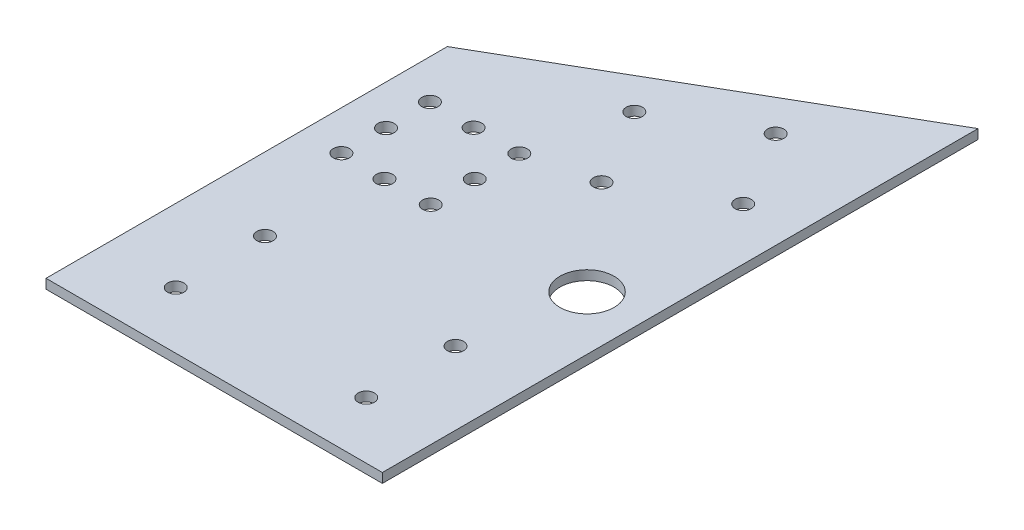
ISO-10303-21;
HEADER;
FILE_DESCRIPTION(('STEP AP214'),'2;1');
FILE_NAME('part.step','',(''),(''),'','','');
FILE_SCHEMA(('AUTOMOTIVE_DESIGN { 1 0 10303 214 1 1 1 1 }'));
ENDSEC;
DATA;
#1=APPLICATION_CONTEXT('core data for automotive mechanical design processes');
#2=APPLICATION_PROTOCOL_DEFINITION('international standard','automotive_design',2000,#1);
#3=PRODUCT_CONTEXT('',#1,'mechanical');
#4=PRODUCT('Part','Part','',(#3));
#5=PRODUCT_RELATED_PRODUCT_CATEGORY('part','',(#4));
#6=PRODUCT_DEFINITION_FORMATION('','',#4);
#7=PRODUCT_DEFINITION_CONTEXT('part definition',#1,'design');
#8=PRODUCT_DEFINITION('design','',#6,#7);
#9=PRODUCT_DEFINITION_SHAPE('','',#8);
#10=(LENGTH_UNIT() NAMED_UNIT(*) SI_UNIT(.MILLI.,.METRE.));
#11=(NAMED_UNIT(*) PLANE_ANGLE_UNIT() SI_UNIT($,.RADIAN.));
#12=(NAMED_UNIT(*) SI_UNIT($,.STERADIAN.) SOLID_ANGLE_UNIT());
#13=UNCERTAINTY_MEASURE_WITH_UNIT(LENGTH_MEASURE(1.E-05),#10,'distance_accuracy_value','');
#14=(GEOMETRIC_REPRESENTATION_CONTEXT(3) GLOBAL_UNCERTAINTY_ASSIGNED_CONTEXT((#13)) GLOBAL_UNIT_ASSIGNED_CONTEXT((#10,
#11,#12)) REPRESENTATION_CONTEXT('',''));
#15=CARTESIAN_POINT('',(0.,0.,0.));
#16=DIRECTION('',(0.,0.,1.));
#17=DIRECTION('',(1.,0.,0.));
#18=AXIS2_PLACEMENT_3D('',#15,#16,#17);
#19=CARTESIAN_POINT('',(0.,3.5,0.));
#20=DIRECTION('',(0.,1.,0.));
#21=DIRECTION('',(0.,0.,1.));
#22=AXIS2_PLACEMENT_3D('',#19,#20,#21);
#23=PLANE('',#22);
#24=CARTESIAN_POINT('',(-9.80070272899665,3.50000000000004,29.0193966277296));
#25=DIRECTION('',(0.,-1.,0.));
#26=DIRECTION('',(0.,0.,-1.));
#27=AXIS2_PLACEMENT_3D('',#24,#25,#26);
#28=CIRCLE('',#27,2.99999999999996);
#29=CARTESIAN_POINT('',(-9.80070272899665,3.50000000000004,26.0193966277297));
#30=VERTEX_POINT('',#29);
#31=EDGE_CURVE('E204',#30,#30,#28,.T.);
#32=ORIENTED_EDGE('',*,*,#31,.T.);
#33=EDGE_LOOP('',(#32));
#34=FACE_BOUND('',#33,.T.);
#35=CARTESIAN_POINT('',(35.166341481369,3.50000000000004,-83.2853062262013));
#36=DIRECTION('',(0.,-1.,0.));
#37=DIRECTION('',(0.,0.,-1.));
#38=AXIS2_PLACEMENT_3D('',#35,#36,#37);
#39=CIRCLE('',#38,2.99999999999995);
#40=CARTESIAN_POINT('',(35.166341481369,3.50000000000004,-86.2853062262013));
#41=VERTEX_POINT('',#40);
#42=EDGE_CURVE('E191',#41,#41,#39,.T.);
#43=ORIENTED_EDGE('',*,*,#42,.T.);
#44=EDGE_LOOP('',(#43));
#45=FACE_BOUND('',#44,.T.);
#46=CARTESIAN_POINT('',(18.6893739268313,3.50000000000004,-111.869808159963));
#47=DIRECTION('',(0.,-1.,0.));
#48=DIRECTION('',(0.,0.,-1.));
#49=AXIS2_PLACEMENT_3D('',#46,#47,#48);
#50=CIRCLE('',#49,2.99999999999995);
#51=CARTESIAN_POINT('',(18.6893739268313,3.50000000000004,-114.869808159963));
#52=VERTEX_POINT('',#51);
#53=EDGE_CURVE('E187',#52,#52,#50,.T.);
#54=ORIENTED_EDGE('',*,*,#53,.T.);
#55=EDGE_LOOP('',(#54));
#56=FACE_BOUND('',#55,.T.);
#57=CARTESIAN_POINT('',(51.7728808308047,3.50000000000004,-130.999098464774));
#58=DIRECTION('',(0.,-1.,0.));
#59=DIRECTION('',(0.,0.,-1.));
#60=AXIS2_PLACEMENT_3D('',#57,#58,#59);
#61=CIRCLE('',#60,2.99999999999995);
#62=CARTESIAN_POINT('',(51.7728808308047,3.50000000000004,-133.999098464774));
#63=VERTEX_POINT('',#62);
#64=EDGE_CURVE('E186',#63,#63,#61,.T.);
#65=ORIENTED_EDGE('',*,*,#64,.T.);
#66=EDGE_LOOP('',(#65));
#67=FACE_BOUND('',#66,.T.);
#68=CARTESIAN_POINT('',(68.2603104177391,3.50000000000004,-102.517776293385));
#69=DIRECTION('',(0.,-1.,0.));
#70=DIRECTION('',(0.,0.,-1.));
#71=AXIS2_PLACEMENT_3D('',#68,#69,#70);
#72=CIRCLE('',#71,2.99999999999996);
#73=CARTESIAN_POINT('',(68.2603104177391,3.50000000000004,-105.517776293385));
#74=VERTEX_POINT('',#73);
#75=EDGE_CURVE('E182',#74,#74,#72,.T.);
#76=ORIENTED_EDGE('',*,*,#75,.T.);
#77=EDGE_LOOP('',(#76));
#78=FACE_BOUND('',#77,.T.);
#79=CARTESIAN_POINT('',(-5.93933245517503,3.5,-77.1329096570055));
#80=DIRECTION('',(0.,1.,0.));
#81=DIRECTION('',(0.,0.,1.));
#82=AXIS2_PLACEMENT_3D('',#79,#80,#81);
#83=CIRCLE('',#82,2.99999999999999);
#84=CARTESIAN_POINT('',(-5.93933245517503,3.5,-74.1329096570055));
#85=VERTEX_POINT('',#84);
#86=EDGE_CURVE('E177',#85,#85,#83,.T.);
#87=ORIENTED_EDGE('',*,*,#86,.F.);
#88=EDGE_LOOP('',(#87));
#89=FACE_BOUND('',#88,.T.);
#90=CARTESIAN_POINT('',(-5.99562083449613,3.49999999999745,-44.2780507197012));
#91=DIRECTION('',(0.,1.,0.));
#92=DIRECTION('',(0.,0.,1.));
#93=AXIS2_PLACEMENT_3D('',#90,#91,#92);
#94=CIRCLE('',#93,2.99999999999999);
#95=CARTESIAN_POINT('',(-5.99562083449613,3.49999999999745,-41.2780507197012));
#96=VERTEX_POINT('',#95);
#97=EDGE_CURVE('E172',#96,#96,#94,.T.);
#98=ORIENTED_EDGE('',*,*,#97,.F.);
#99=EDGE_LOOP('',(#98));
#100=FACE_BOUND('',#99,.T.);
#101=CARTESIAN_POINT('',(10.6965095388021,3.5,-60.9230178026109));
#102=DIRECTION('',(0.,1.,0.));
#103=DIRECTION('',(0.,0.,1.));
#104=AXIS2_PLACEMENT_3D('',#101,#102,#103);
#105=CIRCLE('',#104,2.99999999999999);
#106=CARTESIAN_POINT('',(10.6965095388021,3.5,-57.923017802611));
#107=VERTEX_POINT('',#106);
#108=EDGE_CURVE('E167',#107,#107,#105,.T.);
#109=ORIENTED_EDGE('',*,*,#108,.F.);
#110=EDGE_LOOP('',(#109));
#111=FACE_BOUND('',#110,.T.);
#112=CARTESIAN_POINT('',(-21.9836339352316,3.49999999999412,-60.8350897133052));
#113=DIRECTION('',(0.,1.,0.));
#114=DIRECTION('',(0.,0.,1.));
#115=AXIS2_PLACEMENT_3D('',#112,#113,#114);
#116=CIRCLE('',#115,2.99999999999999);
#117=CARTESIAN_POINT('',(-21.9836339352316,3.49999999999412,-57.8350897133052));
#118=VERTEX_POINT('',#117);
#119=EDGE_CURVE('E162',#118,#118,#116,.T.);
#120=ORIENTED_EDGE('',*,*,#119,.F.);
#121=EDGE_LOOP('',(#120));
#122=FACE_BOUND('',#121,.T.);
#123=CARTESIAN_POINT('',(-22.196476194119,3.49999999999999,-44.5730614047825));
#124=DIRECTION('',(0.,-1.,0.));
#125=DIRECTION('',(0.,0.,-1.));
#126=AXIS2_PLACEMENT_3D('',#123,#124,#125);
#127=CIRCLE('',#126,2.99999999999995);
#128=CARTESIAN_POINT('',(-22.196476194119,3.49999999999999,-47.5730614047824));
#129=VERTEX_POINT('',#128);
#130=EDGE_CURVE('E157',#129,#129,#127,.T.);
#131=ORIENTED_EDGE('',*,*,#130,.T.);
#132=EDGE_LOOP('',(#131));
#133=FACE_BOUND('',#132,.T.);
#134=CARTESIAN_POINT('',(10.7634000000005,3.49999999999999,-44.5865701704838));
#135=DIRECTION('',(0.,-1.,0.));
#136=DIRECTION('',(0.,0.,-1.));
#137=AXIS2_PLACEMENT_3D('',#134,#135,#136);
#138=CIRCLE('',#137,2.99999999999996);
#139=CARTESIAN_POINT('',(10.7634000000005,3.49999999999999,-47.5865701704837));
#140=VERTEX_POINT('',#139);
#141=EDGE_CURVE('E152',#140,#140,#138,.T.);
#142=ORIENTED_EDGE('',*,*,#141,.T.);
#143=EDGE_LOOP('',(#142));
#144=FACE_BOUND('',#143,.T.);
#145=CARTESIAN_POINT('',(10.7634000000011,3.49999999999999,-77.3099708436573));
#146=DIRECTION('',(0.,-1.,0.));
#147=DIRECTION('',(0.,0.,-1.));
#148=AXIS2_PLACEMENT_3D('',#145,#146,#147);
#149=CIRCLE('',#148,2.99999999999996);
#150=CARTESIAN_POINT('',(10.7634000000011,3.49999999999999,-80.3099708436572));
#151=VERTEX_POINT('',#150);
#152=EDGE_CURVE('E147',#151,#151,#149,.T.);
#153=ORIENTED_EDGE('',*,*,#152,.T.);
#154=EDGE_LOOP('',(#153));
#155=FACE_BOUND('',#154,.T.);
#156=CARTESIAN_POINT('',(-22.2365999998677,3.49999999999999,-77.3099708436573));
#157=DIRECTION('',(0.,-1.,0.));
#158=DIRECTION('',(0.,0.,-1.));
#159=AXIS2_PLACEMENT_3D('',#156,#157,#158);
#160=CIRCLE('',#159,2.99999999999995);
#161=CARTESIAN_POINT('',(-22.2365999998677,3.49999999999999,-80.3099708436573));
#162=VERTEX_POINT('',#161);
#163=EDGE_CURVE('E146',#162,#162,#160,.T.);
#164=ORIENTED_EDGE('',*,*,#163,.T.);
#165=EDGE_LOOP('',(#164));
#166=FACE_BOUND('',#165,.T.);
#167=CARTESIAN_POINT('',(-9.80070272899659,3.50000000000004,-3.94272746035045));
#168=DIRECTION('',(0.,-1.,0.));
#169=DIRECTION('',(0.,0.,-1.));
#170=AXIS2_PLACEMENT_3D('',#167,#168,#169);
#171=CIRCLE('',#170,2.99999999999996);
#172=CARTESIAN_POINT('',(-9.80070272899659,3.50000000000004,-6.94272746035041));
#173=VERTEX_POINT('',#172);
#174=EDGE_CURVE('E141',#173,#173,#171,.T.);
#175=ORIENTED_EDGE('',*,*,#174,.T.);
#176=EDGE_LOOP('',(#175));
#177=FACE_BOUND('',#176,.T.);
#178=CARTESIAN_POINT('',(60.5775706837832,3.50000000000004,-3.94094338704159));
#179=DIRECTION('',(0.,-1.,0.));
#180=DIRECTION('',(0.,0.,-1.));
#181=AXIS2_PLACEMENT_3D('',#178,#179,#180);
#182=CIRCLE('',#181,2.99999999999996);
#183=CARTESIAN_POINT('',(60.5775706837832,3.50000000000004,-6.94094338704155));
#184=VERTEX_POINT('',#183);
#185=EDGE_CURVE('E136',#184,#184,#182,.T.);
#186=ORIENTED_EDGE('',*,*,#185,.T.);
#187=EDGE_LOOP('',(#186));
#188=FACE_BOUND('',#187,.T.);
#189=CARTESIAN_POINT('',(60.5641027289967,3.50000000000004,29.0193966277296));
#190=DIRECTION('',(0.,-1.,0.));
#191=DIRECTION('',(0.,0.,-1.));
#192=AXIS2_PLACEMENT_3D('',#189,#190,#191);
#193=CIRCLE('',#192,2.99999999999996);
#194=CARTESIAN_POINT('',(60.5641027289967,3.50000000000004,26.0193966277297));
#195=VERTEX_POINT('',#194);
#196=EDGE_CURVE('E135',#195,#195,#193,.T.);
#197=ORIENTED_EDGE('',*,*,#196,.T.);
#198=EDGE_LOOP('',(#197));
#199=FACE_BOUND('',#198,.T.);
#200=DIRECTION('',(0.,0.,-1.));
#201=VECTOR('',#200,1.);
#202=CARTESIAN_POINT('',(87.5,3.5,0.));
#203=LINE('',#202,#201);
#204=CARTESIAN_POINT('',(87.5,3.5,50.));
#205=VERTEX_POINT('',#204);
#206=CARTESIAN_POINT('',(87.5,3.5,-170.));
#207=VERTEX_POINT('',#206);
#208=EDGE_CURVE('E91',#205,#207,#203,.T.);
#209=ORIENTED_EDGE('',*,*,#208,.T.);
#210=DIRECTION('',(-0.865928383336909,0.,0.500168006705274));
#211=VECTOR('',#210,1.);
#212=CARTESIAN_POINT('',(87.5,3.5,-170.));
#213=LINE('',#212,#211);
#214=CARTESIAN_POINT('',(-36.7366,3.5,-98.2398247042286));
#215=VERTEX_POINT('',#214);
#216=EDGE_CURVE('E94',#207,#215,#213,.T.);
#217=ORIENTED_EDGE('',*,*,#216,.T.);
#218=DIRECTION('',(0.,0.,1.));
#219=VECTOR('',#218,1.);
#220=CARTESIAN_POINT('',(-36.7366,3.5,-58.2398247042286));
#221=LINE('',#220,#219);
#222=CARTESIAN_POINT('',(-36.7366,3.5,50.));
#223=VERTEX_POINT('',#222);
#224=EDGE_CURVE('E98',#215,#223,#221,.T.);
#225=ORIENTED_EDGE('',*,*,#224,.T.);
#226=DIRECTION('',(1.,0.,0.));
#227=VECTOR('',#226,1.);
#228=CARTESIAN_POINT('',(-36.7366,3.5,50.));
#229=LINE('',#228,#227);
#230=EDGE_CURVE('E63',#223,#205,#229,.T.);
#231=ORIENTED_EDGE('',*,*,#230,.T.);
#232=EDGE_LOOP('',(#209,#217,#225,#231));
#233=FACE_BOUND('',#232,.T.);
#234=CARTESIAN_POINT('',(67.5,3.5,-45.58328615));
#235=DIRECTION('',(0.,1.,0.));
#236=DIRECTION('',(0.,0.,1.));
#237=AXIS2_PLACEMENT_3D('',#234,#235,#236);
#238=CIRCLE('',#237,9.99999999999999);
#239=CARTESIAN_POINT('',(67.5,3.5,-35.58328615));
#240=VERTEX_POINT('',#239);
#241=EDGE_CURVE('E118',#240,#240,#238,.T.);
#242=ORIENTED_EDGE('',*,*,#241,.F.);
#243=EDGE_LOOP('',(#242));
#244=FACE_BOUND('',#243,.T.);
#245=ADVANCED_FACE('F43',(#34,#45,#56,#67,#78,#89,#100,#111,#122,#133,#144,#155,#166,#177,#188,
#199,#233,#244),#23,.T.);
#246=CARTESIAN_POINT('',(0.,0.,0.));
#247=DIRECTION('',(0.,1.,0.));
#248=DIRECTION('',(0.,0.,1.));
#249=AXIS2_PLACEMENT_3D('',#246,#247,#248);
#250=PLANE('',#249);
#251=CARTESIAN_POINT('',(-9.80070272899665,0.,29.0193966277296));
#252=DIRECTION('',(0.,1.,0.));
#253=DIRECTION('',(0.,0.,1.));
#254=AXIS2_PLACEMENT_3D('',#251,#252,#253);
#255=CIRCLE('',#254,2.99999999999997);
#256=CARTESIAN_POINT('',(-9.80070272899665,0.,32.0193966277296));
#257=VERTEX_POINT('',#256);
#258=EDGE_CURVE('E47',#257,#257,#255,.T.);
#259=ORIENTED_EDGE('',*,*,#258,.T.);
#260=EDGE_LOOP('',(#259));
#261=FACE_BOUND('',#260,.T.);
#262=CARTESIAN_POINT('',(35.166341481369,0.,-83.2853062262013));
#263=DIRECTION('',(0.,1.,0.));
#264=DIRECTION('',(0.,0.,1.));
#265=AXIS2_PLACEMENT_3D('',#262,#263,#264);
#266=CIRCLE('',#265,2.99999999999997);
#267=CARTESIAN_POINT('',(35.166341481369,0.,-80.2853062262013));
#268=VERTEX_POINT('',#267);
#269=EDGE_CURVE('E188',#268,#268,#266,.T.);
#270=ORIENTED_EDGE('',*,*,#269,.T.);
#271=EDGE_LOOP('',(#270));
#272=FACE_BOUND('',#271,.T.);
#273=CARTESIAN_POINT('',(18.6893739268313,0.,-111.869808159963));
#274=DIRECTION('',(0.,1.,0.));
#275=DIRECTION('',(0.,0.,1.));
#276=AXIS2_PLACEMENT_3D('',#273,#274,#275);
#277=CIRCLE('',#276,2.99999999999997);
#278=CARTESIAN_POINT('',(18.6893739268313,0.,-108.869808159963));
#279=VERTEX_POINT('',#278);
#280=EDGE_CURVE('E183',#279,#279,#277,.T.);
#281=ORIENTED_EDGE('',*,*,#280,.T.);
#282=EDGE_LOOP('',(#281));
#283=FACE_BOUND('',#282,.T.);
#284=CARTESIAN_POINT('',(51.7728808308047,0.,-130.999098464774));
#285=DIRECTION('',(0.,1.,0.));
#286=DIRECTION('',(0.,0.,1.));
#287=AXIS2_PLACEMENT_3D('',#284,#285,#286);
#288=CIRCLE('',#287,2.99999999999997);
#289=CARTESIAN_POINT('',(51.7728808308047,0.,-127.999098464774));
#290=VERTEX_POINT('',#289);
#291=EDGE_CURVE('E210',#290,#290,#288,.T.);
#292=ORIENTED_EDGE('',*,*,#291,.T.);
#293=EDGE_LOOP('',(#292));
#294=FACE_BOUND('',#293,.T.);
#295=CARTESIAN_POINT('',(68.2603104177391,0.,-102.517776293385));
#296=DIRECTION('',(0.,1.,0.));
#297=DIRECTION('',(0.,0.,1.));
#298=AXIS2_PLACEMENT_3D('',#295,#296,#297);
#299=CIRCLE('',#298,2.99999999999998);
#300=CARTESIAN_POINT('',(68.2603104177391,0.,-99.5177762933853));
#301=VERTEX_POINT('',#300);
#302=EDGE_CURVE('E178',#301,#301,#299,.T.);
#303=ORIENTED_EDGE('',*,*,#302,.T.);
#304=EDGE_LOOP('',(#303));
#305=FACE_BOUND('',#304,.T.);
#306=CARTESIAN_POINT('',(-5.93933245517503,0.,-77.1329096570055));
#307=DIRECTION('',(0.,1.,0.));
#308=DIRECTION('',(0.,0.,1.));
#309=AXIS2_PLACEMENT_3D('',#306,#307,#308);
#310=CIRCLE('',#309,2.99999999999999);
#311=CARTESIAN_POINT('',(-5.93933245517503,0.,-74.1329096570055));
#312=VERTEX_POINT('',#311);
#313=EDGE_CURVE('E173',#312,#312,#310,.T.);
#314=ORIENTED_EDGE('',*,*,#313,.T.);
#315=EDGE_LOOP('',(#314));
#316=FACE_BOUND('',#315,.T.);
#317=CARTESIAN_POINT('',(-5.99562083449613,0.,-44.2780507197012));
#318=DIRECTION('',(0.,1.,0.));
#319=DIRECTION('',(0.,0.,1.));
#320=AXIS2_PLACEMENT_3D('',#317,#318,#319);
#321=CIRCLE('',#320,2.99999999999999);
#322=CARTESIAN_POINT('',(-5.99562083449613,0.,-41.2780507197012));
#323=VERTEX_POINT('',#322);
#324=EDGE_CURVE('E168',#323,#323,#321,.T.);
#325=ORIENTED_EDGE('',*,*,#324,.T.);
#326=EDGE_LOOP('',(#325));
#327=FACE_BOUND('',#326,.T.);
#328=CARTESIAN_POINT('',(10.6965095388021,0.,-60.9230178026109));
#329=DIRECTION('',(0.,1.,0.));
#330=DIRECTION('',(0.,0.,1.));
#331=AXIS2_PLACEMENT_3D('',#328,#329,#330);
#332=CIRCLE('',#331,2.99999999999999);
#333=CARTESIAN_POINT('',(10.6965095388021,0.,-57.923017802611));
#334=VERTEX_POINT('',#333);
#335=EDGE_CURVE('E163',#334,#334,#332,.T.);
#336=ORIENTED_EDGE('',*,*,#335,.T.);
#337=EDGE_LOOP('',(#336));
#338=FACE_BOUND('',#337,.T.);
#339=CARTESIAN_POINT('',(-21.9836339352316,0.,-60.8350897133052));
#340=DIRECTION('',(0.,1.,0.));
#341=DIRECTION('',(0.,0.,1.));
#342=AXIS2_PLACEMENT_3D('',#339,#340,#341);
#343=CIRCLE('',#342,2.99999999999999);
#344=CARTESIAN_POINT('',(-21.9836339352316,0.,-57.8350897133052));
#345=VERTEX_POINT('',#344);
#346=EDGE_CURVE('E158',#345,#345,#343,.T.);
#347=ORIENTED_EDGE('',*,*,#346,.T.);
#348=EDGE_LOOP('',(#347));
#349=FACE_BOUND('',#348,.T.);
#350=CARTESIAN_POINT('',(-22.196476194119,0.,-44.5730614047825));
#351=DIRECTION('',(0.,1.,0.));
#352=DIRECTION('',(0.,0.,1.));
#353=AXIS2_PLACEMENT_3D('',#350,#351,#352);
#354=CIRCLE('',#353,2.99999999999997);
#355=CARTESIAN_POINT('',(-22.196476194119,0.,-41.5730614047825));
#356=VERTEX_POINT('',#355);
#357=EDGE_CURVE('E153',#356,#356,#354,.T.);
#358=ORIENTED_EDGE('',*,*,#357,.T.);
#359=EDGE_LOOP('',(#358));
#360=FACE_BOUND('',#359,.T.);
#361=CARTESIAN_POINT('',(10.7634000000005,0.,-44.5865701704838));
#362=DIRECTION('',(0.,1.,0.));
#363=DIRECTION('',(0.,0.,1.));
#364=AXIS2_PLACEMENT_3D('',#361,#362,#363);
#365=CIRCLE('',#364,2.99999999999997);
#366=CARTESIAN_POINT('',(10.7634000000005,0.,-41.5865701704838));
#367=VERTEX_POINT('',#366);
#368=EDGE_CURVE('E148',#367,#367,#365,.T.);
#369=ORIENTED_EDGE('',*,*,#368,.T.);
#370=EDGE_LOOP('',(#369));
#371=FACE_BOUND('',#370,.T.);
#372=CARTESIAN_POINT('',(10.7634000000011,0.,-77.3099708436573));
#373=DIRECTION('',(0.,1.,0.));
#374=DIRECTION('',(0.,0.,1.));
#375=AXIS2_PLACEMENT_3D('',#372,#373,#374);
#376=CIRCLE('',#375,2.99999999999997);
#377=CARTESIAN_POINT('',(10.7634000000011,0.,-74.3099708436573));
#378=VERTEX_POINT('',#377);
#379=EDGE_CURVE('E142',#378,#378,#376,.T.);
#380=ORIENTED_EDGE('',*,*,#379,.T.);
#381=EDGE_LOOP('',(#380));
#382=FACE_BOUND('',#381,.T.);
#383=CARTESIAN_POINT('',(-22.2365999998677,0.,-77.3099708436573));
#384=DIRECTION('',(0.,1.,0.));
#385=DIRECTION('',(0.,0.,1.));
#386=AXIS2_PLACEMENT_3D('',#383,#384,#385);
#387=CIRCLE('',#386,2.99999999999998);
#388=CARTESIAN_POINT('',(-22.2365999998677,0.,-74.3099708436574));
#389=VERTEX_POINT('',#388);
#390=EDGE_CURVE('E241',#389,#389,#387,.T.);
#391=ORIENTED_EDGE('',*,*,#390,.T.);
#392=EDGE_LOOP('',(#391));
#393=FACE_BOUND('',#392,.T.);
#394=CARTESIAN_POINT('',(-9.80070272899659,0.,-3.94272746035045));
#395=DIRECTION('',(0.,1.,0.));
#396=DIRECTION('',(0.,0.,1.));
#397=AXIS2_PLACEMENT_3D('',#394,#395,#396);
#398=CIRCLE('',#397,2.99999999999997);
#399=CARTESIAN_POINT('',(-9.80070272899659,0.,-0.94272746035048));
#400=VERTEX_POINT('',#399);
#401=EDGE_CURVE('E137',#400,#400,#398,.T.);
#402=ORIENTED_EDGE('',*,*,#401,.T.);
#403=EDGE_LOOP('',(#402));
#404=FACE_BOUND('',#403,.T.);
#405=CARTESIAN_POINT('',(60.5775706837832,0.,-3.94094338704159));
#406=DIRECTION('',(0.,1.,0.));
#407=DIRECTION('',(0.,0.,1.));
#408=AXIS2_PLACEMENT_3D('',#405,#406,#407);
#409=CIRCLE('',#408,2.99999999999998);
#410=CARTESIAN_POINT('',(60.5775706837832,0.,-0.940943387041617));
#411=VERTEX_POINT('',#410);
#412=EDGE_CURVE('E131',#411,#411,#409,.T.);
#413=ORIENTED_EDGE('',*,*,#412,.T.);
#414=EDGE_LOOP('',(#413));
#415=FACE_BOUND('',#414,.T.);
#416=CARTESIAN_POINT('',(60.5641027289967,0.,29.0193966277296));
#417=DIRECTION('',(0.,1.,0.));
#418=DIRECTION('',(0.,0.,1.));
#419=AXIS2_PLACEMENT_3D('',#416,#417,#418);
#420=CIRCLE('',#419,2.99999999999998);
#421=CARTESIAN_POINT('',(60.5641027289967,0.,32.0193966277296));
#422=VERTEX_POINT('',#421);
#423=EDGE_CURVE('E254',#422,#422,#420,.T.);
#424=ORIENTED_EDGE('',*,*,#423,.T.);
#425=EDGE_LOOP('',(#424));
#426=FACE_BOUND('',#425,.T.);
#427=DIRECTION('',(0.,0.,-1.));
#428=VECTOR('',#427,1.);
#429=CARTESIAN_POINT('',(87.5,0.,-130.));
#430=LINE('',#429,#428);
#431=CARTESIAN_POINT('',(87.5,0.,50.));
#432=VERTEX_POINT('',#431);
#433=CARTESIAN_POINT('',(87.5,0.,-170.));
#434=VERTEX_POINT('',#433);
#435=EDGE_CURVE('E86',#432,#434,#430,.T.);
#436=ORIENTED_EDGE('',*,*,#435,.F.);
#437=DIRECTION('',(1.,0.,0.));
#438=VECTOR('',#437,1.);
#439=CARTESIAN_POINT('',(-36.7366,0.,50.));
#440=LINE('',#439,#438);
#441=CARTESIAN_POINT('',(-36.7366,0.,50.));
#442=VERTEX_POINT('',#441);
#443=EDGE_CURVE('E123',#442,#432,#440,.T.);
#444=ORIENTED_EDGE('',*,*,#443,.F.);
#445=DIRECTION('',(0.,0.,1.));
#446=VECTOR('',#445,1.);
#447=CARTESIAN_POINT('',(-36.7366,0.,50.));
#448=LINE('',#447,#446);
#449=CARTESIAN_POINT('',(-36.7366,0.,-98.2398247042286));
#450=VERTEX_POINT('',#449);
#451=EDGE_CURVE('E79',#450,#442,#448,.T.);
#452=ORIENTED_EDGE('',*,*,#451,.F.);
#453=DIRECTION('',(-0.865928383336909,0.,0.500168006705274));
#454=VECTOR('',#453,1.);
#455=CARTESIAN_POINT('',(87.5,0.,-170.));
#456=LINE('',#455,#454);
#457=EDGE_CURVE('E104',#434,#450,#456,.T.);
#458=ORIENTED_EDGE('',*,*,#457,.F.);
#459=EDGE_LOOP('',(#436,#444,#452,#458));
#460=FACE_BOUND('',#459,.T.);
#461=CARTESIAN_POINT('',(67.5,0.,-45.58328615));
#462=DIRECTION('',(0.,1.,0.));
#463=DIRECTION('',(0.,0.,1.));
#464=AXIS2_PLACEMENT_3D('',#461,#462,#463);
#465=CIRCLE('',#464,9.99999999999999);
#466=CARTESIAN_POINT('',(67.5,0.,-35.58328615));
#467=VERTEX_POINT('',#466);
#468=EDGE_CURVE('E258',#467,#467,#465,.T.);
#469=ORIENTED_EDGE('',*,*,#468,.T.);
#470=EDGE_LOOP('',(#469));
#471=FACE_BOUND('',#470,.T.);
#472=ADVANCED_FACE('F267',(#261,#272,#283,#294,#305,#316,#327,#338,#349,#360,#371,#382,#393,
#404,#415,#426,#460,#471),#250,.F.);
#473=CARTESIAN_POINT('',(87.5,3.5,-130.));
#474=DIRECTION('',(-1.,0.,0.));
#475=DIRECTION('',(0.,0.,1.));
#476=AXIS2_PLACEMENT_3D('',#473,#474,#475);
#477=PLANE('',#476);
#478=ORIENTED_EDGE('',*,*,#435,.T.);
#479=DIRECTION('',(0.,-1.,0.));
#480=VECTOR('',#479,1.);
#481=CARTESIAN_POINT('',(87.5,3.5,-170.));
#482=LINE('',#481,#480);
#483=EDGE_CURVE('E11',#207,#434,#482,.T.);
#484=ORIENTED_EDGE('',*,*,#483,.F.);
#485=ORIENTED_EDGE('',*,*,#208,.F.);
#486=DIRECTION('',(0.,-1.,0.));
#487=VECTOR('',#486,1.);
#488=CARTESIAN_POINT('',(87.5,3.5,50.));
#489=LINE('',#488,#487);
#490=EDGE_CURVE('E112',#205,#432,#489,.T.);
#491=ORIENTED_EDGE('',*,*,#490,.T.);
#492=EDGE_LOOP('',(#478,#484,#485,#491));
#493=FACE_BOUND('',#492,.T.);
#494=ADVANCED_FACE('F45',(#493),#477,.F.);
#495=CARTESIAN_POINT('',(87.5,3.5,-170.));
#496=DIRECTION('',(0.500168006705274,0.,0.865928383336909));
#497=DIRECTION('',(0.865928383336909,0.,-0.500168006705275));
#498=AXIS2_PLACEMENT_3D('',#495,#496,#497);
#499=PLANE('',#498);
#500=ORIENTED_EDGE('',*,*,#457,.T.);
#501=DIRECTION('',(0.,-1.,0.));
#502=VECTOR('',#501,1.);
#503=CARTESIAN_POINT('',(-36.7366,3.5,-98.2398247042286));
#504=LINE('',#503,#502);
#505=EDGE_CURVE('E54',#215,#450,#504,.T.);
#506=ORIENTED_EDGE('',*,*,#505,.F.);
#507=ORIENTED_EDGE('',*,*,#216,.F.);
#508=ORIENTED_EDGE('',*,*,#483,.T.);
#509=EDGE_LOOP('',(#500,#506,#507,#508));
#510=FACE_BOUND('',#509,.T.);
#511=ADVANCED_FACE('F103',(#510),#499,.F.);
#512=CARTESIAN_POINT('',(-36.7366,3.5,50.));
#513=DIRECTION('',(1.,0.,0.));
#514=DIRECTION('',(0.,0.,-1.));
#515=AXIS2_PLACEMENT_3D('',#512,#513,#514);
#516=PLANE('',#515);
#517=ORIENTED_EDGE('',*,*,#451,.T.);
#518=DIRECTION('',(0.,-1.,0.));
#519=VECTOR('',#518,1.);
#520=CARTESIAN_POINT('',(-36.7366,3.5,50.));
#521=LINE('',#520,#519);
#522=EDGE_CURVE('E106',#223,#442,#521,.T.);
#523=ORIENTED_EDGE('',*,*,#522,.F.);
#524=ORIENTED_EDGE('',*,*,#224,.F.);
#525=ORIENTED_EDGE('',*,*,#505,.T.);
#526=EDGE_LOOP('',(#517,#523,#524,#525));
#527=FACE_BOUND('',#526,.T.);
#528=ADVANCED_FACE('F108',(#527),#516,.F.);
#529=CARTESIAN_POINT('',(-36.7366,3.5,50.));
#530=DIRECTION('',(0.,0.,-1.));
#531=DIRECTION('',(-1.,0.,0.));
#532=AXIS2_PLACEMENT_3D('',#529,#530,#531);
#533=PLANE('',#532);
#534=ORIENTED_EDGE('',*,*,#443,.T.);
#535=ORIENTED_EDGE('',*,*,#490,.F.);
#536=ORIENTED_EDGE('',*,*,#230,.F.);
#537=ORIENTED_EDGE('',*,*,#522,.T.);
#538=EDGE_LOOP('',(#534,#535,#536,#537));
#539=FACE_BOUND('',#538,.T.);
#540=ADVANCED_FACE('F272',(#539),#533,.F.);
#541=CARTESIAN_POINT('',(67.5,3.5,-45.58328615));
#542=DIRECTION('',(0.,-1.,0.));
#543=DIRECTION('',(0.,0.,-1.));
#544=AXIS2_PLACEMENT_3D('',#541,#542,#543);
#545=CYLINDRICAL_SURFACE('',#544,9.99999999999999);
#546=ORIENTED_EDGE('',*,*,#241,.T.);
#547=EDGE_LOOP('',(#546));
#548=FACE_BOUND('',#547,.T.);
#549=ORIENTED_EDGE('',*,*,#468,.F.);
#550=EDGE_LOOP('',(#549));
#551=FACE_BOUND('',#550,.T.);
#552=ADVANCED_FACE('F269',(#548,#551),#545,.F.);
#553=CARTESIAN_POINT('',(60.5641027289967,-96.5,29.0193966277296));
#554=DIRECTION('',(0.,-1.,0.));
#555=DIRECTION('',(0.,0.,-1.));
#556=AXIS2_PLACEMENT_3D('',#553,#554,#555);
#557=CYLINDRICAL_SURFACE('',#556,2.99999999999998);
#558=ORIENTED_EDGE('',*,*,#196,.F.);
#559=EDGE_LOOP('',(#558));
#560=FACE_BOUND('',#559,.T.);
#561=ORIENTED_EDGE('',*,*,#423,.F.);
#562=EDGE_LOOP('',(#561));
#563=FACE_BOUND('',#562,.T.);
#564=ADVANCED_FACE('F271',(#560,#563),#557,.F.);
#565=CARTESIAN_POINT('',(60.5775706837832,-96.5,-3.94094338704159));
#566=DIRECTION('',(0.,-1.,0.));
#567=DIRECTION('',(0.,0.,-1.));
#568=AXIS2_PLACEMENT_3D('',#565,#566,#567);
#569=CYLINDRICAL_SURFACE('',#568,2.99999999999998);
#570=ORIENTED_EDGE('',*,*,#185,.F.);
#571=EDGE_LOOP('',(#570));
#572=FACE_BOUND('',#571,.T.);
#573=ORIENTED_EDGE('',*,*,#412,.F.);
#574=EDGE_LOOP('',(#573));
#575=FACE_BOUND('',#574,.T.);
#576=ADVANCED_FACE('F279',(#572,#575),#569,.F.);
#577=CARTESIAN_POINT('',(-9.80070272899659,-96.5,-3.94272746035045));
#578=DIRECTION('',(0.,-1.,0.));
#579=DIRECTION('',(0.,0.,-1.));
#580=AXIS2_PLACEMENT_3D('',#577,#578,#579);
#581=CYLINDRICAL_SURFACE('',#580,2.99999999999997);
#582=ORIENTED_EDGE('',*,*,#174,.F.);
#583=EDGE_LOOP('',(#582));
#584=FACE_BOUND('',#583,.T.);
#585=ORIENTED_EDGE('',*,*,#401,.F.);
#586=EDGE_LOOP('',(#585));
#587=FACE_BOUND('',#586,.T.);
#588=ADVANCED_FACE('F418',(#584,#587),#581,.F.);
#589=CARTESIAN_POINT('',(-22.2365999998677,-96.5000000000001,-77.3099708436573));
#590=DIRECTION('',(0.,-1.,0.));
#591=DIRECTION('',(0.,0.,-1.));
#592=AXIS2_PLACEMENT_3D('',#589,#590,#591);
#593=CYLINDRICAL_SURFACE('',#592,2.99999999999998);
#594=ORIENTED_EDGE('',*,*,#163,.F.);
#595=EDGE_LOOP('',(#594));
#596=FACE_BOUND('',#595,.T.);
#597=ORIENTED_EDGE('',*,*,#390,.F.);
#598=EDGE_LOOP('',(#597));
#599=FACE_BOUND('',#598,.T.);
#600=ADVANCED_FACE('F410',(#596,#599),#593,.F.);
#601=CARTESIAN_POINT('',(10.7634000000011,-96.5000000000001,-77.3099708436573));
#602=DIRECTION('',(0.,-1.,0.));
#603=DIRECTION('',(0.,0.,-1.));
#604=AXIS2_PLACEMENT_3D('',#601,#602,#603);
#605=CYLINDRICAL_SURFACE('',#604,2.99999999999997);
#606=ORIENTED_EDGE('',*,*,#152,.F.);
#607=EDGE_LOOP('',(#606));
#608=FACE_BOUND('',#607,.T.);
#609=ORIENTED_EDGE('',*,*,#379,.F.);
#610=EDGE_LOOP('',(#609));
#611=FACE_BOUND('',#610,.T.);
#612=ADVANCED_FACE('F402',(#608,#611),#605,.F.);
#613=CARTESIAN_POINT('',(10.7634000000005,-96.5000000000001,-44.5865701704838));
#614=DIRECTION('',(0.,-1.,0.));
#615=DIRECTION('',(0.,0.,-1.));
#616=AXIS2_PLACEMENT_3D('',#613,#614,#615);
#617=CYLINDRICAL_SURFACE('',#616,2.99999999999997);
#618=ORIENTED_EDGE('',*,*,#141,.F.);
#619=EDGE_LOOP('',(#618));
#620=FACE_BOUND('',#619,.T.);
#621=ORIENTED_EDGE('',*,*,#368,.F.);
#622=EDGE_LOOP('',(#621));
#623=FACE_BOUND('',#622,.T.);
#624=ADVANCED_FACE('F394',(#620,#623),#617,.F.);
#625=CARTESIAN_POINT('',(-22.196476194119,-96.5000000000001,-44.5730614047825));
#626=DIRECTION('',(0.,-1.,0.));
#627=DIRECTION('',(0.,0.,-1.));
#628=AXIS2_PLACEMENT_3D('',#625,#626,#627);
#629=CYLINDRICAL_SURFACE('',#628,2.99999999999997);
#630=ORIENTED_EDGE('',*,*,#130,.F.);
#631=EDGE_LOOP('',(#630));
#632=FACE_BOUND('',#631,.T.);
#633=ORIENTED_EDGE('',*,*,#357,.F.);
#634=EDGE_LOOP('',(#633));
#635=FACE_BOUND('',#634,.T.);
#636=ADVANCED_FACE('F386',(#632,#635),#629,.F.);
#637=CARTESIAN_POINT('',(-21.9836339352316,3.49999999999412,-60.8350897133052));
#638=DIRECTION('',(0.,1.,0.));
#639=DIRECTION('',(0.,0.,1.));
#640=AXIS2_PLACEMENT_3D('',#637,#638,#639);
#641=CYLINDRICAL_SURFACE('',#640,2.99999999999999);
#642=ORIENTED_EDGE('',*,*,#119,.T.);
#643=EDGE_LOOP('',(#642));
#644=FACE_BOUND('',#643,.T.);
#645=ORIENTED_EDGE('',*,*,#346,.F.);
#646=EDGE_LOOP('',(#645));
#647=FACE_BOUND('',#646,.T.);
#648=ADVANCED_FACE('F378',(#644,#647),#641,.F.);
#649=CARTESIAN_POINT('',(10.6965095388021,3.5,-60.9230178026109));
#650=DIRECTION('',(0.,1.,0.));
#651=DIRECTION('',(0.,0.,1.));
#652=AXIS2_PLACEMENT_3D('',#649,#650,#651);
#653=CYLINDRICAL_SURFACE('',#652,2.99999999999999);
#654=ORIENTED_EDGE('',*,*,#108,.T.);
#655=EDGE_LOOP('',(#654));
#656=FACE_BOUND('',#655,.T.);
#657=ORIENTED_EDGE('',*,*,#335,.F.);
#658=EDGE_LOOP('',(#657));
#659=FACE_BOUND('',#658,.T.);
#660=ADVANCED_FACE('F370',(#656,#659),#653,.F.);
#661=CARTESIAN_POINT('',(-5.99562083449613,3.49999999999745,-44.2780507197012));
#662=DIRECTION('',(0.,1.,0.));
#663=DIRECTION('',(0.,0.,1.));
#664=AXIS2_PLACEMENT_3D('',#661,#662,#663);
#665=CYLINDRICAL_SURFACE('',#664,2.99999999999999);
#666=ORIENTED_EDGE('',*,*,#97,.T.);
#667=EDGE_LOOP('',(#666));
#668=FACE_BOUND('',#667,.T.);
#669=ORIENTED_EDGE('',*,*,#324,.F.);
#670=EDGE_LOOP('',(#669));
#671=FACE_BOUND('',#670,.T.);
#672=ADVANCED_FACE('F362',(#668,#671),#665,.F.);
#673=CARTESIAN_POINT('',(-5.93933245517503,3.5,-77.1329096570055));
#674=DIRECTION('',(0.,1.,0.));
#675=DIRECTION('',(0.,0.,1.));
#676=AXIS2_PLACEMENT_3D('',#673,#674,#675);
#677=CYLINDRICAL_SURFACE('',#676,2.99999999999999);
#678=ORIENTED_EDGE('',*,*,#86,.T.);
#679=EDGE_LOOP('',(#678));
#680=FACE_BOUND('',#679,.T.);
#681=ORIENTED_EDGE('',*,*,#313,.F.);
#682=EDGE_LOOP('',(#681));
#683=FACE_BOUND('',#682,.T.);
#684=ADVANCED_FACE('F354',(#680,#683),#677,.F.);
#685=CARTESIAN_POINT('',(68.2603104177391,-96.5000000000028,-102.517776293385));
#686=DIRECTION('',(0.,-1.,0.));
#687=DIRECTION('',(0.,0.,-1.));
#688=AXIS2_PLACEMENT_3D('',#685,#686,#687);
#689=CYLINDRICAL_SURFACE('',#688,2.99999999999998);
#690=ORIENTED_EDGE('',*,*,#75,.F.);
#691=EDGE_LOOP('',(#690));
#692=FACE_BOUND('',#691,.T.);
#693=ORIENTED_EDGE('',*,*,#302,.F.);
#694=EDGE_LOOP('',(#693));
#695=FACE_BOUND('',#694,.T.);
#696=ADVANCED_FACE('F346',(#692,#695),#689,.F.);
#697=CARTESIAN_POINT('',(51.7728808308047,-96.5000000000001,-130.999098464774));
#698=DIRECTION('',(0.,-1.,0.));
#699=DIRECTION('',(0.,0.,-1.));
#700=AXIS2_PLACEMENT_3D('',#697,#698,#699);
#701=CYLINDRICAL_SURFACE('',#700,2.99999999999997);
#702=ORIENTED_EDGE('',*,*,#64,.F.);
#703=EDGE_LOOP('',(#702));
#704=FACE_BOUND('',#703,.T.);
#705=ORIENTED_EDGE('',*,*,#291,.F.);
#706=EDGE_LOOP('',(#705));
#707=FACE_BOUND('',#706,.T.);
#708=ADVANCED_FACE('F338',(#704,#707),#701,.F.);
#709=CARTESIAN_POINT('',(18.6893739268313,-96.5000000000001,-111.869808159963));
#710=DIRECTION('',(0.,-1.,0.));
#711=DIRECTION('',(0.,0.,-1.));
#712=AXIS2_PLACEMENT_3D('',#709,#710,#711);
#713=CYLINDRICAL_SURFACE('',#712,2.99999999999997);
#714=ORIENTED_EDGE('',*,*,#53,.F.);
#715=EDGE_LOOP('',(#714));
#716=FACE_BOUND('',#715,.T.);
#717=ORIENTED_EDGE('',*,*,#280,.F.);
#718=EDGE_LOOP('',(#717));
#719=FACE_BOUND('',#718,.T.);
#720=ADVANCED_FACE('F331',(#716,#719),#713,.F.);
#721=CARTESIAN_POINT('',(35.166341481369,-96.5000000000001,-83.2853062262013));
#722=DIRECTION('',(0.,-1.,0.));
#723=DIRECTION('',(0.,0.,-1.));
#724=AXIS2_PLACEMENT_3D('',#721,#722,#723);
#725=CYLINDRICAL_SURFACE('',#724,2.99999999999997);
#726=ORIENTED_EDGE('',*,*,#42,.F.);
#727=EDGE_LOOP('',(#726));
#728=FACE_BOUND('',#727,.T.);
#729=ORIENTED_EDGE('',*,*,#269,.F.);
#730=EDGE_LOOP('',(#729));
#731=FACE_BOUND('',#730,.T.);
#732=ADVANCED_FACE('F320',(#728,#731),#725,.F.);
#733=CARTESIAN_POINT('',(-9.80070272899665,-96.5000000000001,29.0193966277296));
#734=DIRECTION('',(0.,-1.,0.));
#735=DIRECTION('',(0.,0.,-1.));
#736=AXIS2_PLACEMENT_3D('',#733,#734,#735);
#737=CYLINDRICAL_SURFACE('',#736,2.99999999999997);
#738=ORIENTED_EDGE('',*,*,#31,.F.);
#739=EDGE_LOOP('',(#738));
#740=FACE_BOUND('',#739,.T.);
#741=ORIENTED_EDGE('',*,*,#258,.F.);
#742=EDGE_LOOP('',(#741));
#743=FACE_BOUND('',#742,.T.);
#744=ADVANCED_FACE('F316',(#740,#743),#737,.F.);
#745=CLOSED_SHELL('',(#245,#472,#494,#511,#528,#540,#552,#564,#576,#588,#600,#612,#624,#636,
#648,#660,#672,#684,#696,#708,#720,#732,#744));
#746=MANIFOLD_SOLID_BREP('B2',#745);
#747=ADVANCED_BREP_SHAPE_REPRESENTATION('',(#18,#746),#14);
#748=SHAPE_DEFINITION_REPRESENTATION(#9,#747);
ENDSEC;
END-ISO-10303-21;
